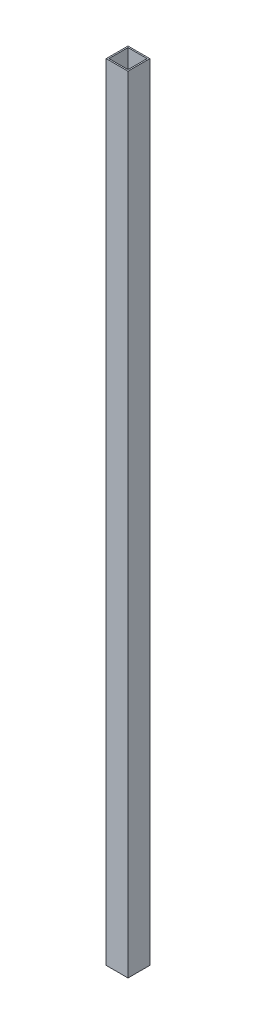
ISO-10303-21;
HEADER;
FILE_DESCRIPTION(('STEP AP214'),'2;1');
FILE_NAME('part.step','',(''),(''),'','','');
FILE_SCHEMA(('AUTOMOTIVE_DESIGN { 1 0 10303 214 1 1 1 1 }'));
ENDSEC;
DATA;
#1=APPLICATION_CONTEXT('core data for automotive mechanical design processes');
#2=APPLICATION_PROTOCOL_DEFINITION('international standard','automotive_design',2000,#1);
#3=PRODUCT_CONTEXT('',#1,'mechanical');
#4=PRODUCT('Part','Part','',(#3));
#5=PRODUCT_RELATED_PRODUCT_CATEGORY('part','',(#4));
#6=PRODUCT_DEFINITION_FORMATION('','',#4);
#7=PRODUCT_DEFINITION_CONTEXT('part definition',#1,'design');
#8=PRODUCT_DEFINITION('design','',#6,#7);
#9=PRODUCT_DEFINITION_SHAPE('','',#8);
#10=(LENGTH_UNIT() NAMED_UNIT(*) SI_UNIT(.MILLI.,.METRE.));
#11=(NAMED_UNIT(*) PLANE_ANGLE_UNIT() SI_UNIT($,.RADIAN.));
#12=(NAMED_UNIT(*) SI_UNIT($,.STERADIAN.) SOLID_ANGLE_UNIT());
#13=UNCERTAINTY_MEASURE_WITH_UNIT(LENGTH_MEASURE(1.E-05),#10,'distance_accuracy_value','');
#14=(GEOMETRIC_REPRESENTATION_CONTEXT(3) GLOBAL_UNCERTAINTY_ASSIGNED_CONTEXT((#13)) GLOBAL_UNIT_ASSIGNED_CONTEXT((#10,
#11,#12)) REPRESENTATION_CONTEXT('',''));
#15=CARTESIAN_POINT('',(0.,0.,0.));
#16=DIRECTION('',(0.,0.,1.));
#17=DIRECTION('',(1.,0.,0.));
#18=AXIS2_PLACEMENT_3D('',#15,#16,#17);
#19=CARTESIAN_POINT('',(0.,914.4,0.));
#20=DIRECTION('',(0.,-1.,0.));
#21=DIRECTION('',(0.,0.,-1.));
#22=AXIS2_PLACEMENT_3D('',#19,#20,#21);
#23=PLANE('',#22);
#24=DIRECTION('',(0.,0.,1.));
#25=VECTOR('',#24,1.);
#26=CARTESIAN_POINT('',(0.,914.4,0.));
#27=LINE('',#26,#25);
#28=CARTESIAN_POINT('',(0.,914.4,-25.4));
#29=VERTEX_POINT('',#28);
#30=CARTESIAN_POINT('',(0.,914.4,0.));
#31=VERTEX_POINT('',#30);
#32=EDGE_CURVE('E134',#29,#31,#27,.T.);
#33=ORIENTED_EDGE('',*,*,#32,.T.);
#34=DIRECTION('',(1.,0.,0.));
#35=VECTOR('',#34,1.);
#36=CARTESIAN_POINT('',(0.,914.4,0.));
#37=LINE('',#36,#35);
#38=CARTESIAN_POINT('',(25.4,914.4,0.));
#39=VERTEX_POINT('',#38);
#40=EDGE_CURVE('E137',#31,#39,#37,.T.);
#41=ORIENTED_EDGE('',*,*,#40,.T.);
#42=DIRECTION('',(0.,0.,-1.));
#43=VECTOR('',#42,1.);
#44=CARTESIAN_POINT('',(25.4,914.4,0.));
#45=LINE('',#44,#43);
#46=CARTESIAN_POINT('',(25.4,914.4,-25.4));
#47=VERTEX_POINT('',#46);
#48=EDGE_CURVE('E140',#39,#47,#45,.T.);
#49=ORIENTED_EDGE('',*,*,#48,.T.);
#50=DIRECTION('',(-1.,0.,0.));
#51=VECTOR('',#50,1.);
#52=CARTESIAN_POINT('',(0.,914.4,-25.4));
#53=LINE('',#52,#51);
#54=EDGE_CURVE('E142',#47,#29,#53,.T.);
#55=ORIENTED_EDGE('',*,*,#54,.T.);
#56=EDGE_LOOP('',(#33,#41,#49,#55));
#57=FACE_BOUND('',#56,.T.);
#58=DIRECTION('',(0.,0.,1.));
#59=VECTOR('',#58,1.);
#60=CARTESIAN_POINT('',(1.5875,914.4,-23.8125));
#61=LINE('',#60,#59);
#62=CARTESIAN_POINT('',(1.5875,914.4,-23.8125));
#63=VERTEX_POINT('',#62);
#64=CARTESIAN_POINT('',(1.5875,914.4,-1.5875));
#65=VERTEX_POINT('',#64);
#66=EDGE_CURVE('E98',#63,#65,#61,.T.);
#67=ORIENTED_EDGE('',*,*,#66,.F.);
#68=DIRECTION('',(-1.,0.,0.));
#69=VECTOR('',#68,1.);
#70=CARTESIAN_POINT('',(1.5875,914.4,-23.8125));
#71=LINE('',#70,#69);
#72=CARTESIAN_POINT('',(23.8125,914.4,-23.8125));
#73=VERTEX_POINT('',#72);
#74=EDGE_CURVE('E120',#73,#63,#71,.T.);
#75=ORIENTED_EDGE('',*,*,#74,.F.);
#76=DIRECTION('',(0.,0.,-1.));
#77=VECTOR('',#76,1.);
#78=CARTESIAN_POINT('',(23.8125,914.4,-23.8125));
#79=LINE('',#78,#77);
#80=CARTESIAN_POINT('',(23.8125,914.4,-1.5875));
#81=VERTEX_POINT('',#80);
#82=EDGE_CURVE('E118',#81,#73,#79,.T.);
#83=ORIENTED_EDGE('',*,*,#82,.F.);
#84=DIRECTION('',(1.,0.,0.));
#85=VECTOR('',#84,1.);
#86=CARTESIAN_POINT('',(1.5875,914.4,-1.5875));
#87=LINE('',#86,#85);
#88=EDGE_CURVE('E106',#65,#81,#87,.T.);
#89=ORIENTED_EDGE('',*,*,#88,.F.);
#90=EDGE_LOOP('',(#67,#75,#83,#89));
#91=FACE_BOUND('',#90,.T.);
#92=ADVANCED_FACE('F33',(#57,#91),#23,.F.);
#93=CARTESIAN_POINT('',(0.,0.,0.));
#94=DIRECTION('',(0.,-1.,0.));
#95=DIRECTION('',(0.,0.,-1.));
#96=AXIS2_PLACEMENT_3D('',#93,#94,#95);
#97=PLANE('',#96);
#98=DIRECTION('',(0.,0.,1.));
#99=VECTOR('',#98,1.);
#100=CARTESIAN_POINT('',(0.,0.,0.));
#101=LINE('',#100,#99);
#102=CARTESIAN_POINT('',(0.,0.,-25.4));
#103=VERTEX_POINT('',#102);
#104=CARTESIAN_POINT('',(0.,0.,0.));
#105=VERTEX_POINT('',#104);
#106=EDGE_CURVE('E114',#103,#105,#101,.T.);
#107=ORIENTED_EDGE('',*,*,#106,.F.);
#108=DIRECTION('',(-1.,0.,0.));
#109=VECTOR('',#108,1.);
#110=CARTESIAN_POINT('',(0.,0.,-25.4));
#111=LINE('',#110,#109);
#112=CARTESIAN_POINT('',(25.4,0.,-25.4));
#113=VERTEX_POINT('',#112);
#114=EDGE_CURVE('E138',#113,#103,#111,.T.);
#115=ORIENTED_EDGE('',*,*,#114,.F.);
#116=DIRECTION('',(0.,0.,-1.));
#117=VECTOR('',#116,1.);
#118=CARTESIAN_POINT('',(25.4,0.,0.));
#119=LINE('',#118,#117);
#120=CARTESIAN_POINT('',(25.4,0.,0.));
#121=VERTEX_POINT('',#120);
#122=EDGE_CURVE('E149',#121,#113,#119,.T.);
#123=ORIENTED_EDGE('',*,*,#122,.F.);
#124=DIRECTION('',(1.,0.,0.));
#125=VECTOR('',#124,1.);
#126=CARTESIAN_POINT('',(0.,0.,0.));
#127=LINE('',#126,#125);
#128=EDGE_CURVE('E147',#105,#121,#127,.T.);
#129=ORIENTED_EDGE('',*,*,#128,.F.);
#130=EDGE_LOOP('',(#107,#115,#123,#129));
#131=FACE_BOUND('',#130,.T.);
#132=DIRECTION('',(-1.,0.,0.));
#133=VECTOR('',#132,1.);
#134=CARTESIAN_POINT('',(1.5875,0.,-23.8125));
#135=LINE('',#134,#133);
#136=CARTESIAN_POINT('',(23.8125,0.,-23.8125));
#137=VERTEX_POINT('',#136);
#138=CARTESIAN_POINT('',(1.5875,0.,-23.8125));
#139=VERTEX_POINT('',#138);
#140=EDGE_CURVE('E107',#137,#139,#135,.T.);
#141=ORIENTED_EDGE('',*,*,#140,.T.);
#142=DIRECTION('',(0.,0.,1.));
#143=VECTOR('',#142,1.);
#144=CARTESIAN_POINT('',(1.5875,0.,-23.8125));
#145=LINE('',#144,#143);
#146=CARTESIAN_POINT('',(1.5875,0.,-1.5875));
#147=VERTEX_POINT('',#146);
#148=EDGE_CURVE('E56',#139,#147,#145,.T.);
#149=ORIENTED_EDGE('',*,*,#148,.T.);
#150=DIRECTION('',(1.,0.,0.));
#151=VECTOR('',#150,1.);
#152=CARTESIAN_POINT('',(1.5875,0.,-1.5875));
#153=LINE('',#152,#151);
#154=CARTESIAN_POINT('',(23.8125,0.,-1.5875));
#155=VERTEX_POINT('',#154);
#156=EDGE_CURVE('E113',#147,#155,#153,.T.);
#157=ORIENTED_EDGE('',*,*,#156,.T.);
#158=DIRECTION('',(0.,0.,-1.));
#159=VECTOR('',#158,1.);
#160=CARTESIAN_POINT('',(23.8125,0.,-23.8125));
#161=LINE('',#160,#159);
#162=EDGE_CURVE('E126',#155,#137,#161,.T.);
#163=ORIENTED_EDGE('',*,*,#162,.T.);
#164=EDGE_LOOP('',(#141,#149,#157,#163));
#165=FACE_BOUND('',#164,.T.);
#166=ADVANCED_FACE('F167',(#131,#165),#97,.T.);
#167=CARTESIAN_POINT('',(0.,914.4,0.));
#168=DIRECTION('',(1.,0.,0.));
#169=DIRECTION('',(0.,0.,-1.));
#170=AXIS2_PLACEMENT_3D('',#167,#168,#169);
#171=PLANE('',#170);
#172=ORIENTED_EDGE('',*,*,#106,.T.);
#173=DIRECTION('',(0.,-1.,0.));
#174=VECTOR('',#173,1.);
#175=CARTESIAN_POINT('',(0.,914.4,0.));
#176=LINE('',#175,#174);
#177=EDGE_CURVE('E11',#31,#105,#176,.T.);
#178=ORIENTED_EDGE('',*,*,#177,.F.);
#179=ORIENTED_EDGE('',*,*,#32,.F.);
#180=DIRECTION('',(0.,-1.,0.));
#181=VECTOR('',#180,1.);
#182=CARTESIAN_POINT('',(0.,914.4,-25.4));
#183=LINE('',#182,#181);
#184=EDGE_CURVE('E144',#29,#103,#183,.T.);
#185=ORIENTED_EDGE('',*,*,#184,.T.);
#186=EDGE_LOOP('',(#172,#178,#179,#185));
#187=FACE_BOUND('',#186,.T.);
#188=ADVANCED_FACE('F35',(#187),#171,.F.);
#189=CARTESIAN_POINT('',(0.,914.4,0.));
#190=DIRECTION('',(0.,0.,-1.));
#191=DIRECTION('',(-1.,0.,0.));
#192=AXIS2_PLACEMENT_3D('',#189,#190,#191);
#193=PLANE('',#192);
#194=ORIENTED_EDGE('',*,*,#128,.T.);
#195=DIRECTION('',(0.,-1.,0.));
#196=VECTOR('',#195,1.);
#197=CARTESIAN_POINT('',(25.4,914.4,0.));
#198=LINE('',#197,#196);
#199=EDGE_CURVE('E41',#39,#121,#198,.T.);
#200=ORIENTED_EDGE('',*,*,#199,.F.);
#201=ORIENTED_EDGE('',*,*,#40,.F.);
#202=ORIENTED_EDGE('',*,*,#177,.T.);
#203=EDGE_LOOP('',(#194,#200,#201,#202));
#204=FACE_BOUND('',#203,.T.);
#205=ADVANCED_FACE('F177',(#204),#193,.F.);
#206=CARTESIAN_POINT('',(25.4,914.4,0.));
#207=DIRECTION('',(-1.,0.,0.));
#208=DIRECTION('',(0.,0.,1.));
#209=AXIS2_PLACEMENT_3D('',#206,#207,#208);
#210=PLANE('',#209);
#211=ORIENTED_EDGE('',*,*,#122,.T.);
#212=DIRECTION('',(0.,-1.,0.));
#213=VECTOR('',#212,1.);
#214=CARTESIAN_POINT('',(25.4,914.4,-25.4));
#215=LINE('',#214,#213);
#216=EDGE_CURVE('E154',#47,#113,#215,.T.);
#217=ORIENTED_EDGE('',*,*,#216,.F.);
#218=ORIENTED_EDGE('',*,*,#48,.F.);
#219=ORIENTED_EDGE('',*,*,#199,.T.);
#220=EDGE_LOOP('',(#211,#217,#218,#219));
#221=FACE_BOUND('',#220,.T.);
#222=ADVANCED_FACE('F161',(#221),#210,.F.);
#223=CARTESIAN_POINT('',(0.,914.4,-25.4));
#224=DIRECTION('',(0.,0.,1.));
#225=DIRECTION('',(1.,0.,0.));
#226=AXIS2_PLACEMENT_3D('',#223,#224,#225);
#227=PLANE('',#226);
#228=ORIENTED_EDGE('',*,*,#114,.T.);
#229=ORIENTED_EDGE('',*,*,#184,.F.);
#230=ORIENTED_EDGE('',*,*,#54,.F.);
#231=ORIENTED_EDGE('',*,*,#216,.T.);
#232=EDGE_LOOP('',(#228,#229,#230,#231));
#233=FACE_BOUND('',#232,.T.);
#234=ADVANCED_FACE('F171',(#233),#227,.F.);
#235=CARTESIAN_POINT('',(1.5875,914.4,-23.8125));
#236=DIRECTION('',(1.,0.,0.));
#237=DIRECTION('',(0.,0.,-1.));
#238=AXIS2_PLACEMENT_3D('',#235,#236,#237);
#239=PLANE('',#238);
#240=ORIENTED_EDGE('',*,*,#148,.F.);
#241=DIRECTION('',(0.,-1.,0.));
#242=VECTOR('',#241,1.);
#243=CARTESIAN_POINT('',(1.5875,914.4,-23.8125));
#244=LINE('',#243,#242);
#245=EDGE_CURVE('E102',#63,#139,#244,.T.);
#246=ORIENTED_EDGE('',*,*,#245,.F.);
#247=ORIENTED_EDGE('',*,*,#66,.T.);
#248=DIRECTION('',(0.,-1.,0.));
#249=VECTOR('',#248,1.);
#250=CARTESIAN_POINT('',(1.5875,914.4,-1.5875));
#251=LINE('',#250,#249);
#252=EDGE_CURVE('E101',#65,#147,#251,.T.);
#253=ORIENTED_EDGE('',*,*,#252,.T.);
#254=EDGE_LOOP('',(#240,#246,#247,#253));
#255=FACE_BOUND('',#254,.T.);
#256=ADVANCED_FACE('F100',(#255),#239,.T.);
#257=CARTESIAN_POINT('',(1.5875,914.4,-1.5875));
#258=DIRECTION('',(0.,0.,-1.));
#259=DIRECTION('',(-1.,0.,0.));
#260=AXIS2_PLACEMENT_3D('',#257,#258,#259);
#261=PLANE('',#260);
#262=ORIENTED_EDGE('',*,*,#156,.F.);
#263=ORIENTED_EDGE('',*,*,#252,.F.);
#264=ORIENTED_EDGE('',*,*,#88,.T.);
#265=DIRECTION('',(0.,-1.,0.));
#266=VECTOR('',#265,1.);
#267=CARTESIAN_POINT('',(23.8125,914.4,-1.5875));
#268=LINE('',#267,#266);
#269=EDGE_CURVE('E115',#81,#155,#268,.T.);
#270=ORIENTED_EDGE('',*,*,#269,.T.);
#271=EDGE_LOOP('',(#262,#263,#264,#270));
#272=FACE_BOUND('',#271,.T.);
#273=ADVANCED_FACE('F110',(#272),#261,.T.);
#274=CARTESIAN_POINT('',(23.8125,914.4,-23.8125));
#275=DIRECTION('',(-1.,0.,0.));
#276=DIRECTION('',(0.,0.,1.));
#277=AXIS2_PLACEMENT_3D('',#274,#275,#276);
#278=PLANE('',#277);
#279=ORIENTED_EDGE('',*,*,#162,.F.);
#280=ORIENTED_EDGE('',*,*,#269,.F.);
#281=ORIENTED_EDGE('',*,*,#82,.T.);
#282=DIRECTION('',(0.,-1.,0.));
#283=VECTOR('',#282,1.);
#284=CARTESIAN_POINT('',(23.8125,914.4,-23.8125));
#285=LINE('',#284,#283);
#286=EDGE_CURVE('E48',#73,#137,#285,.T.);
#287=ORIENTED_EDGE('',*,*,#286,.T.);
#288=EDGE_LOOP('',(#279,#280,#281,#287));
#289=FACE_BOUND('',#288,.T.);
#290=ADVANCED_FACE('F200',(#289),#278,.T.);
#291=CARTESIAN_POINT('',(1.5875,914.4,-23.8125));
#292=DIRECTION('',(0.,0.,1.));
#293=DIRECTION('',(1.,0.,0.));
#294=AXIS2_PLACEMENT_3D('',#291,#292,#293);
#295=PLANE('',#294);
#296=ORIENTED_EDGE('',*,*,#140,.F.);
#297=ORIENTED_EDGE('',*,*,#286,.F.);
#298=ORIENTED_EDGE('',*,*,#74,.T.);
#299=ORIENTED_EDGE('',*,*,#245,.T.);
#300=EDGE_LOOP('',(#296,#297,#298,#299));
#301=FACE_BOUND('',#300,.T.);
#302=ADVANCED_FACE('F204',(#301),#295,.T.);
#303=CLOSED_SHELL('',(#92,#166,#188,#205,#222,#234,#256,#273,#290,#302));
#304=MANIFOLD_SOLID_BREP('B2',#303);
#305=ADVANCED_BREP_SHAPE_REPRESENTATION('',(#18,#304),#14);
#306=SHAPE_DEFINITION_REPRESENTATION(#9,#305);
ENDSEC;
END-ISO-10303-21;
